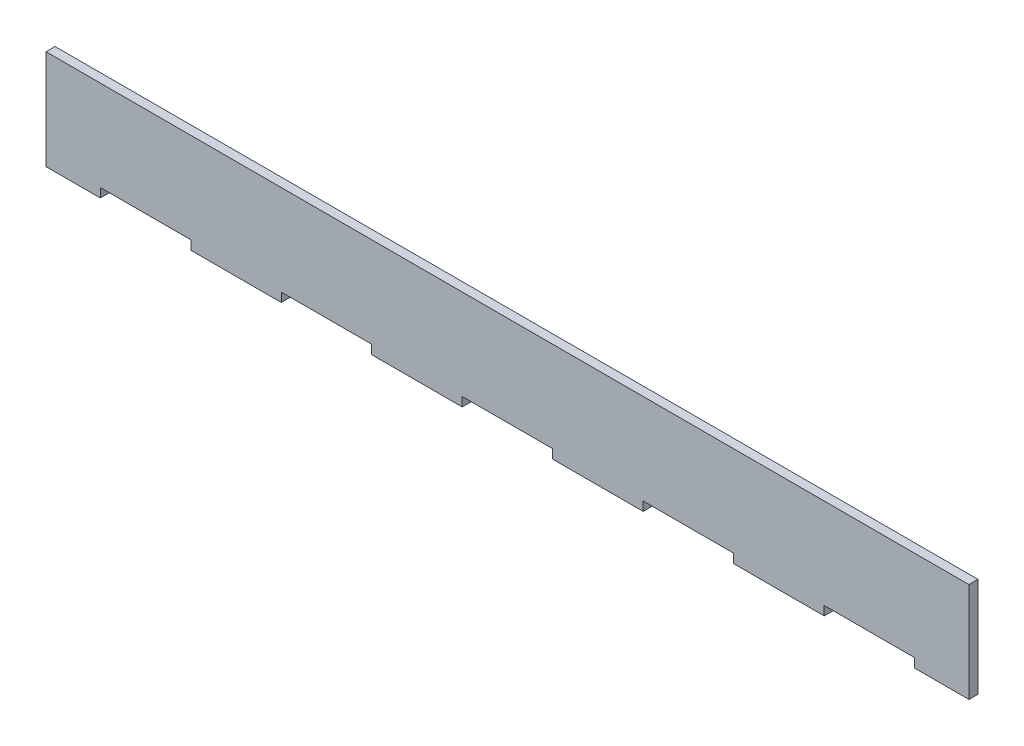
ISO-10303-21;
HEADER;
FILE_DESCRIPTION(('STEP AP214'),'2;1');
FILE_NAME('part.step','',(''),(''),'','','');
FILE_SCHEMA(('AUTOMOTIVE_DESIGN { 1 0 10303 214 1 1 1 1 }'));
ENDSEC;
DATA;
#1=APPLICATION_CONTEXT('core data for automotive mechanical design processes');
#2=APPLICATION_PROTOCOL_DEFINITION('international standard','automotive_design',2000,#1);
#3=PRODUCT_CONTEXT('',#1,'mechanical');
#4=PRODUCT('Part','Part','',(#3));
#5=PRODUCT_RELATED_PRODUCT_CATEGORY('part','',(#4));
#6=PRODUCT_DEFINITION_FORMATION('','',#4);
#7=PRODUCT_DEFINITION_CONTEXT('part definition',#1,'design');
#8=PRODUCT_DEFINITION('design','',#6,#7);
#9=PRODUCT_DEFINITION_SHAPE('','',#8);
#10=(LENGTH_UNIT() NAMED_UNIT(*) SI_UNIT(.MILLI.,.METRE.));
#11=(NAMED_UNIT(*) PLANE_ANGLE_UNIT() SI_UNIT($,.RADIAN.));
#12=(NAMED_UNIT(*) SI_UNIT($,.STERADIAN.) SOLID_ANGLE_UNIT());
#13=UNCERTAINTY_MEASURE_WITH_UNIT(LENGTH_MEASURE(1.E-05),#10,'distance_accuracy_value','');
#14=(GEOMETRIC_REPRESENTATION_CONTEXT(3) GLOBAL_UNCERTAINTY_ASSIGNED_CONTEXT((#13)) GLOBAL_UNIT_ASSIGNED_CONTEXT((#10,
#11,#12)) REPRESENTATION_CONTEXT('',''));
#15=CARTESIAN_POINT('',(0.,0.,0.));
#16=DIRECTION('',(0.,0.,1.));
#17=DIRECTION('',(1.,0.,0.));
#18=AXIS2_PLACEMENT_3D('',#15,#16,#17);
#19=CARTESIAN_POINT('',(255.,-27.5,5.));
#20=DIRECTION('',(0.,1.,0.));
#21=DIRECTION('',(-1.,0.,0.));
#22=AXIS2_PLACEMENT_3D('',#19,#20,#21);
#23=PLANE('',#22);
#24=DIRECTION('',(1.,0.,0.));
#25=VECTOR('',#24,1.);
#26=CARTESIAN_POINT('',(255.,-27.5,0.));
#27=LINE('',#26,#25);
#28=CARTESIAN_POINT('',(25.,-27.5,0.));
#29=VERTEX_POINT('',#28);
#30=CARTESIAN_POINT('',(75.,-27.5,0.));
#31=VERTEX_POINT('',#30);
#32=EDGE_CURVE('E221',#29,#31,#27,.T.);
#33=ORIENTED_EDGE('',*,*,#32,.T.);
#34=DIRECTION('',(0.,0.,1.));
#35=VECTOR('',#34,1.);
#36=CARTESIAN_POINT('',(75.,-27.5,0.));
#37=LINE('',#36,#35);
#38=CARTESIAN_POINT('',(75.,-27.5,5.));
#39=VERTEX_POINT('',#38);
#40=EDGE_CURVE('E325',#31,#39,#37,.T.);
#41=ORIENTED_EDGE('',*,*,#40,.T.);
#42=DIRECTION('',(1.,0.,0.));
#43=VECTOR('',#42,1.);
#44=CARTESIAN_POINT('',(255.,-27.5,5.));
#45=LINE('',#44,#43);
#46=CARTESIAN_POINT('',(25.,-27.5,5.));
#47=VERTEX_POINT('',#46);
#48=EDGE_CURVE('E403',#47,#39,#45,.T.);
#49=ORIENTED_EDGE('',*,*,#48,.F.);
#50=DIRECTION('',(0.,0.,1.));
#51=VECTOR('',#50,1.);
#52=CARTESIAN_POINT('',(25.,-27.5,0.));
#53=LINE('',#52,#51);
#54=EDGE_CURVE('E384',#29,#47,#53,.T.);
#55=ORIENTED_EDGE('',*,*,#54,.F.);
#56=EDGE_LOOP('',(#33,#41,#49,#55));
#57=FACE_BOUND('',#56,.T.);
#58=ADVANCED_FACE('F33',(#57),#23,.F.);
#59=CARTESIAN_POINT('',(-175.,-27.5,0.));
#60=VERTEX_POINT('',#59);
#61=CARTESIAN_POINT('',(-125.,-27.5,0.));
#62=VERTEX_POINT('',#61);
#63=EDGE_CURVE('E232',#60,#62,#27,.T.);
#64=ORIENTED_EDGE('',*,*,#63,.T.);
#65=DIRECTION('',(0.,0.,1.));
#66=VECTOR('',#65,1.);
#67=CARTESIAN_POINT('',(-125.,-27.5,0.));
#68=LINE('',#67,#66);
#69=CARTESIAN_POINT('',(-125.,-27.5,5.));
#70=VERTEX_POINT('',#69);
#71=EDGE_CURVE('E350',#62,#70,#68,.T.);
#72=ORIENTED_EDGE('',*,*,#71,.T.);
#73=CARTESIAN_POINT('',(-175.,-27.5,5.));
#74=VERTEX_POINT('',#73);
#75=EDGE_CURVE('E277',#74,#70,#45,.T.);
#76=ORIENTED_EDGE('',*,*,#75,.F.);
#77=DIRECTION('',(0.,0.,1.));
#78=VECTOR('',#77,1.);
#79=CARTESIAN_POINT('',(-175.,-27.5,0.));
#80=LINE('',#79,#78);
#81=EDGE_CURVE('E315',#60,#74,#80,.T.);
#82=ORIENTED_EDGE('',*,*,#81,.F.);
#83=EDGE_LOOP('',(#64,#72,#76,#82));
#84=FACE_BOUND('',#83,.T.);
#85=ADVANCED_FACE('F428',(#84),#23,.F.);
#86=CARTESIAN_POINT('',(125.,-27.5,5.));
#87=VERTEX_POINT('',#86);
#88=CARTESIAN_POINT('',(175.,-27.5,5.));
#89=VERTEX_POINT('',#88);
#90=EDGE_CURVE('E270',#87,#89,#45,.T.);
#91=ORIENTED_EDGE('',*,*,#90,.F.);
#92=DIRECTION('',(0.,0.,1.));
#93=VECTOR('',#92,1.);
#94=CARTESIAN_POINT('',(125.,-27.5,0.));
#95=LINE('',#94,#93);
#96=CARTESIAN_POINT('',(125.,-27.5,0.));
#97=VERTEX_POINT('',#96);
#98=EDGE_CURVE('E220',#97,#87,#95,.T.);
#99=ORIENTED_EDGE('',*,*,#98,.F.);
#100=CARTESIAN_POINT('',(175.,-27.5,0.));
#101=VERTEX_POINT('',#100);
#102=EDGE_CURVE('E213',#97,#101,#27,.T.);
#103=ORIENTED_EDGE('',*,*,#102,.T.);
#104=DIRECTION('',(0.,0.,1.));
#105=VECTOR('',#104,1.);
#106=CARTESIAN_POINT('',(175.,-27.5,0.));
#107=LINE('',#106,#105);
#108=EDGE_CURVE('E194',#101,#89,#107,.T.);
#109=ORIENTED_EDGE('',*,*,#108,.T.);
#110=EDGE_LOOP('',(#91,#99,#103,#109));
#111=FACE_BOUND('',#110,.T.);
#112=ADVANCED_FACE('F219',(#111),#23,.F.);
#113=CARTESIAN_POINT('',(-255.,-27.5,0.));
#114=VERTEX_POINT('',#113);
#115=CARTESIAN_POINT('',(-225.,-27.5,0.));
#116=VERTEX_POINT('',#115);
#117=EDGE_CURVE('E227',#114,#116,#27,.T.);
#118=ORIENTED_EDGE('',*,*,#117,.T.);
#119=DIRECTION('',(0.,0.,1.));
#120=VECTOR('',#119,1.);
#121=CARTESIAN_POINT('',(-225.,-27.5,0.));
#122=LINE('',#121,#120);
#123=CARTESIAN_POINT('',(-225.,-27.5,5.));
#124=VERTEX_POINT('',#123);
#125=EDGE_CURVE('E303',#116,#124,#122,.T.);
#126=ORIENTED_EDGE('',*,*,#125,.T.);
#127=CARTESIAN_POINT('',(-255.,-27.5,5.));
#128=VERTEX_POINT('',#127);
#129=EDGE_CURVE('E272',#128,#124,#45,.T.);
#130=ORIENTED_EDGE('',*,*,#129,.F.);
#131=DIRECTION('',(0.,0.,-1.));
#132=VECTOR('',#131,1.);
#133=CARTESIAN_POINT('',(-255.,-27.5,5.));
#134=LINE('',#133,#132);
#135=EDGE_CURVE('E11',#128,#114,#134,.T.);
#136=ORIENTED_EDGE('',*,*,#135,.T.);
#137=EDGE_LOOP('',(#118,#126,#130,#136));
#138=FACE_BOUND('',#137,.T.);
#139=ADVANCED_FACE('F440',(#138),#23,.F.);
#140=CARTESIAN_POINT('',(-75.,-27.5,5.));
#141=VERTEX_POINT('',#140);
#142=CARTESIAN_POINT('',(-25.,-27.5,5.));
#143=VERTEX_POINT('',#142);
#144=EDGE_CURVE('E395',#141,#143,#45,.T.);
#145=ORIENTED_EDGE('',*,*,#144,.F.);
#146=DIRECTION('',(0.,0.,1.));
#147=VECTOR('',#146,1.);
#148=CARTESIAN_POINT('',(-75.,-27.5,0.));
#149=LINE('',#148,#147);
#150=CARTESIAN_POINT('',(-75.,-27.5,0.));
#151=VERTEX_POINT('',#150);
#152=EDGE_CURVE('E361',#151,#141,#149,.T.);
#153=ORIENTED_EDGE('',*,*,#152,.F.);
#154=CARTESIAN_POINT('',(-25.,-27.5,0.));
#155=VERTEX_POINT('',#154);
#156=EDGE_CURVE('E225',#151,#155,#27,.T.);
#157=ORIENTED_EDGE('',*,*,#156,.T.);
#158=DIRECTION('',(0.,0.,1.));
#159=VECTOR('',#158,1.);
#160=CARTESIAN_POINT('',(-25.,-27.5,0.));
#161=LINE('',#160,#159);
#162=EDGE_CURVE('E274',#155,#143,#161,.T.);
#163=ORIENTED_EDGE('',*,*,#162,.T.);
#164=EDGE_LOOP('',(#145,#153,#157,#163));
#165=FACE_BOUND('',#164,.T.);
#166=ADVANCED_FACE('F393',(#165),#23,.F.);
#167=CARTESIAN_POINT('',(-255.,27.5,5.));
#168=DIRECTION('',(1.,0.,0.));
#169=DIRECTION('',(0.,0.,-1.));
#170=AXIS2_PLACEMENT_3D('',#167,#168,#169);
#171=PLANE('',#170);
#172=DIRECTION('',(0.,-1.,0.));
#173=VECTOR('',#172,1.);
#174=CARTESIAN_POINT('',(-255.,27.5,0.));
#175=LINE('',#174,#173);
#176=CARTESIAN_POINT('',(-255.,27.5,0.));
#177=VERTEX_POINT('',#176);
#178=EDGE_CURVE('E226',#177,#114,#175,.T.);
#179=ORIENTED_EDGE('',*,*,#178,.T.);
#180=ORIENTED_EDGE('',*,*,#135,.F.);
#181=DIRECTION('',(0.,-1.,0.));
#182=VECTOR('',#181,1.);
#183=CARTESIAN_POINT('',(-255.,27.5,5.));
#184=LINE('',#183,#182);
#185=CARTESIAN_POINT('',(-255.,27.5,5.));
#186=VERTEX_POINT('',#185);
#187=EDGE_CURVE('E237',#186,#128,#184,.T.);
#188=ORIENTED_EDGE('',*,*,#187,.F.);
#189=DIRECTION('',(0.,0.,-1.));
#190=VECTOR('',#189,1.);
#191=CARTESIAN_POINT('',(-255.,27.5,5.));
#192=LINE('',#191,#190);
#193=EDGE_CURVE('E238',#186,#177,#192,.T.);
#194=ORIENTED_EDGE('',*,*,#193,.T.);
#195=EDGE_LOOP('',(#179,#180,#188,#194));
#196=FACE_BOUND('',#195,.T.);
#197=ADVANCED_FACE('F35',(#196),#171,.F.);
#198=CARTESIAN_POINT('',(225.,-27.5,5.));
#199=VERTEX_POINT('',#198);
#200=CARTESIAN_POINT('',(255.,-27.5,5.));
#201=VERTEX_POINT('',#200);
#202=EDGE_CURVE('E268',#199,#201,#45,.T.);
#203=ORIENTED_EDGE('',*,*,#202,.F.);
#204=DIRECTION('',(0.,0.,1.));
#205=VECTOR('',#204,1.);
#206=CARTESIAN_POINT('',(225.,-27.5,0.));
#207=LINE('',#206,#205);
#208=CARTESIAN_POINT('',(225.,-27.5,0.));
#209=VERTEX_POINT('',#208);
#210=EDGE_CURVE('E205',#209,#199,#207,.T.);
#211=ORIENTED_EDGE('',*,*,#210,.F.);
#212=CARTESIAN_POINT('',(255.,-27.5,0.));
#213=VERTEX_POINT('',#212);
#214=EDGE_CURVE('E222',#209,#213,#27,.T.);
#215=ORIENTED_EDGE('',*,*,#214,.T.);
#216=DIRECTION('',(0.,0.,-1.));
#217=VECTOR('',#216,1.);
#218=CARTESIAN_POINT('',(255.,-27.5,5.));
#219=LINE('',#218,#217);
#220=EDGE_CURVE('E41',#201,#213,#219,.T.);
#221=ORIENTED_EDGE('',*,*,#220,.F.);
#222=EDGE_LOOP('',(#203,#211,#215,#221));
#223=FACE_BOUND('',#222,.T.);
#224=ADVANCED_FACE('F285',(#223),#23,.F.);
#225=CARTESIAN_POINT('',(255.,27.5,5.));
#226=DIRECTION('',(-1.,0.,0.));
#227=DIRECTION('',(0.,0.,1.));
#228=AXIS2_PLACEMENT_3D('',#225,#226,#227);
#229=PLANE('',#228);
#230=DIRECTION('',(0.,1.,0.));
#231=VECTOR('',#230,1.);
#232=CARTESIAN_POINT('',(255.,27.5,0.));
#233=LINE('',#232,#231);
#234=CARTESIAN_POINT('',(255.,27.5,0.));
#235=VERTEX_POINT('',#234);
#236=EDGE_CURVE('E231',#213,#235,#233,.T.);
#237=ORIENTED_EDGE('',*,*,#236,.T.);
#238=DIRECTION('',(0.,0.,-1.));
#239=VECTOR('',#238,1.);
#240=CARTESIAN_POINT('',(255.,27.5,5.));
#241=LINE('',#240,#239);
#242=CARTESIAN_POINT('',(255.,27.5,5.));
#243=VERTEX_POINT('',#242);
#244=EDGE_CURVE('E241',#243,#235,#241,.T.);
#245=ORIENTED_EDGE('',*,*,#244,.F.);
#246=DIRECTION('',(0.,1.,0.));
#247=VECTOR('',#246,1.);
#248=CARTESIAN_POINT('',(255.,27.5,5.));
#249=LINE('',#248,#247);
#250=EDGE_CURVE('E251',#201,#243,#249,.T.);
#251=ORIENTED_EDGE('',*,*,#250,.F.);
#252=ORIENTED_EDGE('',*,*,#220,.T.);
#253=EDGE_LOOP('',(#237,#245,#251,#252));
#254=FACE_BOUND('',#253,.T.);
#255=ADVANCED_FACE('F249',(#254),#229,.F.);
#256=CARTESIAN_POINT('',(255.,27.5,5.));
#257=DIRECTION('',(0.,-1.,0.));
#258=DIRECTION('',(1.,0.,0.));
#259=AXIS2_PLACEMENT_3D('',#256,#257,#258);
#260=PLANE('',#259);
#261=DIRECTION('',(-1.,0.,0.));
#262=VECTOR('',#261,1.);
#263=CARTESIAN_POINT('',(255.,27.5,0.));
#264=LINE('',#263,#262);
#265=EDGE_CURVE('E235',#235,#177,#264,.T.);
#266=ORIENTED_EDGE('',*,*,#265,.T.);
#267=ORIENTED_EDGE('',*,*,#193,.F.);
#268=DIRECTION('',(-1.,0.,0.));
#269=VECTOR('',#268,1.);
#270=CARTESIAN_POINT('',(255.,27.5,5.));
#271=LINE('',#270,#269);
#272=EDGE_CURVE('E242',#243,#186,#271,.T.);
#273=ORIENTED_EDGE('',*,*,#272,.F.);
#274=ORIENTED_EDGE('',*,*,#244,.T.);
#275=EDGE_LOOP('',(#266,#267,#273,#274));
#276=FACE_BOUND('',#275,.T.);
#277=ADVANCED_FACE('F260',(#276),#260,.F.);
#278=CARTESIAN_POINT('',(0.,0.,5.));
#279=DIRECTION('',(0.,0.,-1.));
#280=DIRECTION('',(-1.,0.,0.));
#281=AXIS2_PLACEMENT_3D('',#278,#279,#280);
#282=PLANE('',#281);
#283=ORIENTED_EDGE('',*,*,#48,.T.);
#284=DIRECTION('',(0.,-1.,0.));
#285=VECTOR('',#284,1.);
#286=CARTESIAN_POINT('',(75.,-27.5,5.));
#287=LINE('',#286,#285);
#288=CARTESIAN_POINT('',(75.,-22.5,5.));
#289=VERTEX_POINT('',#288);
#290=EDGE_CURVE('E326',#289,#39,#287,.T.);
#291=ORIENTED_EDGE('',*,*,#290,.F.);
#292=DIRECTION('',(-1.,0.,0.));
#293=VECTOR('',#292,1.);
#294=CARTESIAN_POINT('',(75.,-22.5,5.));
#295=LINE('',#294,#293);
#296=CARTESIAN_POINT('',(125.,-22.5,5.));
#297=VERTEX_POINT('',#296);
#298=EDGE_CURVE('E322',#297,#289,#295,.T.);
#299=ORIENTED_EDGE('',*,*,#298,.F.);
#300=DIRECTION('',(0.,1.,0.));
#301=VECTOR('',#300,1.);
#302=CARTESIAN_POINT('',(125.,-27.5,5.));
#303=LINE('',#302,#301);
#304=EDGE_CURVE('E328',#87,#297,#303,.T.);
#305=ORIENTED_EDGE('',*,*,#304,.F.);
#306=ORIENTED_EDGE('',*,*,#90,.T.);
#307=DIRECTION('',(0.,-1.,0.));
#308=VECTOR('',#307,1.);
#309=CARTESIAN_POINT('',(175.,-27.5,5.));
#310=LINE('',#309,#308);
#311=CARTESIAN_POINT('',(175.,-22.5,5.));
#312=VERTEX_POINT('',#311);
#313=EDGE_CURVE('E200',#312,#89,#310,.T.);
#314=ORIENTED_EDGE('',*,*,#313,.F.);
#315=DIRECTION('',(-1.,0.,0.));
#316=VECTOR('',#315,1.);
#317=CARTESIAN_POINT('',(175.,-22.5,5.));
#318=LINE('',#317,#316);
#319=CARTESIAN_POINT('',(225.,-22.5,5.));
#320=VERTEX_POINT('',#319);
#321=EDGE_CURVE('E216',#320,#312,#318,.T.);
#322=ORIENTED_EDGE('',*,*,#321,.F.);
#323=DIRECTION('',(0.,1.,0.));
#324=VECTOR('',#323,1.);
#325=CARTESIAN_POINT('',(225.,-27.5,5.));
#326=LINE('',#325,#324);
#327=EDGE_CURVE('E283',#199,#320,#326,.T.);
#328=ORIENTED_EDGE('',*,*,#327,.F.);
#329=ORIENTED_EDGE('',*,*,#202,.T.);
#330=ORIENTED_EDGE('',*,*,#250,.T.);
#331=ORIENTED_EDGE('',*,*,#272,.T.);
#332=ORIENTED_EDGE('',*,*,#187,.T.);
#333=ORIENTED_EDGE('',*,*,#129,.T.);
#334=DIRECTION('',(0.,-1.,0.));
#335=VECTOR('',#334,1.);
#336=CARTESIAN_POINT('',(-225.,-27.5,5.));
#337=LINE('',#336,#335);
#338=CARTESIAN_POINT('',(-225.,-22.5,5.));
#339=VERTEX_POINT('',#338);
#340=EDGE_CURVE('E304',#339,#124,#337,.T.);
#341=ORIENTED_EDGE('',*,*,#340,.F.);
#342=DIRECTION('',(-1.,0.,0.));
#343=VECTOR('',#342,1.);
#344=CARTESIAN_POINT('',(-225.,-22.5,5.));
#345=LINE('',#344,#343);
#346=CARTESIAN_POINT('',(-175.,-22.5,5.));
#347=VERTEX_POINT('',#346);
#348=EDGE_CURVE('E297',#347,#339,#345,.T.);
#349=ORIENTED_EDGE('',*,*,#348,.F.);
#350=DIRECTION('',(0.,1.,0.));
#351=VECTOR('',#350,1.);
#352=CARTESIAN_POINT('',(-175.,-27.5,5.));
#353=LINE('',#352,#351);
#354=EDGE_CURVE('E306',#74,#347,#353,.T.);
#355=ORIENTED_EDGE('',*,*,#354,.F.);
#356=ORIENTED_EDGE('',*,*,#75,.T.);
#357=DIRECTION('',(0.,-1.,0.));
#358=VECTOR('',#357,1.);
#359=CARTESIAN_POINT('',(-125.,-27.5,5.));
#360=LINE('',#359,#358);
#361=CARTESIAN_POINT('',(-125.,-22.5,5.));
#362=VERTEX_POINT('',#361);
#363=EDGE_CURVE('E351',#362,#70,#360,.T.);
#364=ORIENTED_EDGE('',*,*,#363,.F.);
#365=DIRECTION('',(-1.,0.,0.));
#366=VECTOR('',#365,1.);
#367=CARTESIAN_POINT('',(-125.,-22.5,5.));
#368=LINE('',#367,#366);
#369=CARTESIAN_POINT('',(-75.,-22.5,5.));
#370=VERTEX_POINT('',#369);
#371=EDGE_CURVE('E346',#370,#362,#368,.T.);
#372=ORIENTED_EDGE('',*,*,#371,.F.);
#373=DIRECTION('',(0.,1.,0.));
#374=VECTOR('',#373,1.);
#375=CARTESIAN_POINT('',(-75.,-27.5,5.));
#376=LINE('',#375,#374);
#377=EDGE_CURVE('E353',#141,#370,#376,.T.);
#378=ORIENTED_EDGE('',*,*,#377,.F.);
#379=ORIENTED_EDGE('',*,*,#144,.T.);
#380=DIRECTION('',(0.,-1.,0.));
#381=VECTOR('',#380,1.);
#382=CARTESIAN_POINT('',(-25.,-27.5,5.));
#383=LINE('',#382,#381);
#384=CARTESIAN_POINT('',(-25.,-22.5,5.));
#385=VERTEX_POINT('',#384);
#386=EDGE_CURVE('E336',#385,#143,#383,.T.);
#387=ORIENTED_EDGE('',*,*,#386,.F.);
#388=DIRECTION('',(-1.,0.,0.));
#389=VECTOR('',#388,1.);
#390=CARTESIAN_POINT('',(-25.,-22.5,5.));
#391=LINE('',#390,#389);
#392=CARTESIAN_POINT('',(25.,-22.5,5.));
#393=VERTEX_POINT('',#392);
#394=EDGE_CURVE('E369',#393,#385,#391,.T.);
#395=ORIENTED_EDGE('',*,*,#394,.F.);
#396=DIRECTION('',(0.,1.,0.));
#397=VECTOR('',#396,1.);
#398=CARTESIAN_POINT('',(25.,-27.5,5.));
#399=LINE('',#398,#397);
#400=EDGE_CURVE('E376',#47,#393,#399,.T.);
#401=ORIENTED_EDGE('',*,*,#400,.F.);
#402=EDGE_LOOP('',(#283,#291,#299,#305,#306,#314,#322,#328,#329,#330,#331,#332,#333,#341,#349,
#355,#356,#364,#372,#378,#379,#387,#395,#401));
#403=FACE_BOUND('',#402,.T.);
#404=ADVANCED_FACE('F279',(#403),#282,.F.);
#405=CARTESIAN_POINT('',(0.,0.,0.));
#406=DIRECTION('',(0.,0.,-1.));
#407=DIRECTION('',(-1.,0.,0.));
#408=AXIS2_PLACEMENT_3D('',#405,#406,#407);
#409=PLANE('',#408);
#410=DIRECTION('',(0.,-1.,0.));
#411=VECTOR('',#410,1.);
#412=CARTESIAN_POINT('',(75.,-27.5,0.));
#413=LINE('',#412,#411);
#414=CARTESIAN_POINT('',(75.,-22.5,0.));
#415=VERTEX_POINT('',#414);
#416=EDGE_CURVE('E319',#415,#31,#413,.T.);
#417=ORIENTED_EDGE('',*,*,#416,.T.);
#418=ORIENTED_EDGE('',*,*,#32,.F.);
#419=DIRECTION('',(0.,1.,0.));
#420=VECTOR('',#419,1.);
#421=CARTESIAN_POINT('',(25.,-27.5,0.));
#422=LINE('',#421,#420);
#423=CARTESIAN_POINT('',(25.,-22.5,0.));
#424=VERTEX_POINT('',#423);
#425=EDGE_CURVE('E368',#29,#424,#422,.T.);
#426=ORIENTED_EDGE('',*,*,#425,.T.);
#427=DIRECTION('',(-1.,0.,0.));
#428=VECTOR('',#427,1.);
#429=CARTESIAN_POINT('',(-25.,-22.5,0.));
#430=LINE('',#429,#428);
#431=CARTESIAN_POINT('',(-25.,-22.5,0.));
#432=VERTEX_POINT('',#431);
#433=EDGE_CURVE('E372',#424,#432,#430,.T.);
#434=ORIENTED_EDGE('',*,*,#433,.T.);
#435=DIRECTION('',(0.,-1.,0.));
#436=VECTOR('',#435,1.);
#437=CARTESIAN_POINT('',(-25.,-27.5,0.));
#438=LINE('',#437,#436);
#439=EDGE_CURVE('E365',#432,#155,#438,.T.);
#440=ORIENTED_EDGE('',*,*,#439,.T.);
#441=ORIENTED_EDGE('',*,*,#156,.F.);
#442=DIRECTION('',(0.,1.,0.));
#443=VECTOR('',#442,1.);
#444=CARTESIAN_POINT('',(-75.,-27.5,0.));
#445=LINE('',#444,#443);
#446=CARTESIAN_POINT('',(-75.,-22.5,0.));
#447=VERTEX_POINT('',#446);
#448=EDGE_CURVE('E345',#151,#447,#445,.T.);
#449=ORIENTED_EDGE('',*,*,#448,.T.);
#450=DIRECTION('',(-1.,0.,0.));
#451=VECTOR('',#450,1.);
#452=CARTESIAN_POINT('',(-125.,-22.5,0.));
#453=LINE('',#452,#451);
#454=CARTESIAN_POINT('',(-125.,-22.5,0.));
#455=VERTEX_POINT('',#454);
#456=EDGE_CURVE('E56',#447,#455,#453,.T.);
#457=ORIENTED_EDGE('',*,*,#456,.T.);
#458=DIRECTION('',(0.,-1.,0.));
#459=VECTOR('',#458,1.);
#460=CARTESIAN_POINT('',(-125.,-27.5,0.));
#461=LINE('',#460,#459);
#462=EDGE_CURVE('E342',#455,#62,#461,.T.);
#463=ORIENTED_EDGE('',*,*,#462,.T.);
#464=ORIENTED_EDGE('',*,*,#63,.F.);
#465=DIRECTION('',(0.,1.,0.));
#466=VECTOR('',#465,1.);
#467=CARTESIAN_POINT('',(-175.,-27.5,0.));
#468=LINE('',#467,#466);
#469=CARTESIAN_POINT('',(-175.,-22.5,0.));
#470=VERTEX_POINT('',#469);
#471=EDGE_CURVE('E296',#60,#470,#468,.T.);
#472=ORIENTED_EDGE('',*,*,#471,.T.);
#473=DIRECTION('',(-1.,0.,0.));
#474=VECTOR('',#473,1.);
#475=CARTESIAN_POINT('',(-225.,-22.5,0.));
#476=LINE('',#475,#474);
#477=CARTESIAN_POINT('',(-225.,-22.5,0.));
#478=VERTEX_POINT('',#477);
#479=EDGE_CURVE('E300',#470,#478,#476,.T.);
#480=ORIENTED_EDGE('',*,*,#479,.T.);
#481=DIRECTION('',(0.,-1.,0.));
#482=VECTOR('',#481,1.);
#483=CARTESIAN_POINT('',(-225.,-27.5,0.));
#484=LINE('',#483,#482);
#485=EDGE_CURVE('E293',#478,#116,#484,.T.);
#486=ORIENTED_EDGE('',*,*,#485,.T.);
#487=ORIENTED_EDGE('',*,*,#117,.F.);
#488=ORIENTED_EDGE('',*,*,#178,.F.);
#489=ORIENTED_EDGE('',*,*,#265,.F.);
#490=ORIENTED_EDGE('',*,*,#236,.F.);
#491=ORIENTED_EDGE('',*,*,#214,.F.);
#492=DIRECTION('',(0.,1.,0.));
#493=VECTOR('',#492,1.);
#494=CARTESIAN_POINT('',(225.,-27.5,0.));
#495=LINE('',#494,#493);
#496=CARTESIAN_POINT('',(225.,-22.5,0.));
#497=VERTEX_POINT('',#496);
#498=EDGE_CURVE('E215',#209,#497,#495,.T.);
#499=ORIENTED_EDGE('',*,*,#498,.T.);
#500=DIRECTION('',(-1.,0.,0.));
#501=VECTOR('',#500,1.);
#502=CARTESIAN_POINT('',(175.,-22.5,0.));
#503=LINE('',#502,#501);
#504=CARTESIAN_POINT('',(175.,-22.5,0.));
#505=VERTEX_POINT('',#504);
#506=EDGE_CURVE('E206',#497,#505,#503,.T.);
#507=ORIENTED_EDGE('',*,*,#506,.T.);
#508=DIRECTION('',(0.,-1.,0.));
#509=VECTOR('',#508,1.);
#510=CARTESIAN_POINT('',(175.,-27.5,0.));
#511=LINE('',#510,#509);
#512=EDGE_CURVE('E197',#505,#101,#511,.T.);
#513=ORIENTED_EDGE('',*,*,#512,.T.);
#514=ORIENTED_EDGE('',*,*,#102,.F.);
#515=DIRECTION('',(0.,1.,0.));
#516=VECTOR('',#515,1.);
#517=CARTESIAN_POINT('',(125.,-27.5,0.));
#518=LINE('',#517,#516);
#519=CARTESIAN_POINT('',(125.,-22.5,0.));
#520=VERTEX_POINT('',#519);
#521=EDGE_CURVE('E321',#97,#520,#518,.T.);
#522=ORIENTED_EDGE('',*,*,#521,.T.);
#523=DIRECTION('',(-1.,0.,0.));
#524=VECTOR('',#523,1.);
#525=CARTESIAN_POINT('',(75.,-22.5,0.));
#526=LINE('',#525,#524);
#527=EDGE_CURVE('E48',#520,#415,#526,.T.);
#528=ORIENTED_EDGE('',*,*,#527,.T.);
#529=EDGE_LOOP('',(#417,#418,#426,#434,#440,#441,#449,#457,#463,#464,#472,#480,#486,#487,#488,
#489,#490,#491,#499,#507,#513,#514,#522,#528));
#530=FACE_BOUND('',#529,.T.);
#531=ADVANCED_FACE('F211',(#530),#409,.T.);
#532=CARTESIAN_POINT('',(-25.,-27.5,0.));
#533=DIRECTION('',(-1.,0.,0.));
#534=DIRECTION('',(0.,0.,1.));
#535=AXIS2_PLACEMENT_3D('',#532,#533,#534);
#536=PLANE('',#535);
#537=ORIENTED_EDGE('',*,*,#386,.T.);
#538=ORIENTED_EDGE('',*,*,#162,.F.);
#539=ORIENTED_EDGE('',*,*,#439,.F.);
#540=DIRECTION('',(0.,0.,1.));
#541=VECTOR('',#540,1.);
#542=CARTESIAN_POINT('',(-25.,-22.5,0.));
#543=LINE('',#542,#541);
#544=EDGE_CURVE('E381',#432,#385,#543,.T.);
#545=ORIENTED_EDGE('',*,*,#544,.T.);
#546=EDGE_LOOP('',(#537,#538,#539,#545));
#547=FACE_BOUND('',#546,.T.);
#548=ADVANCED_FACE('F469',(#547),#536,.F.);
#549=CARTESIAN_POINT('',(-25.,-22.5,0.));
#550=DIRECTION('',(0.,1.,0.));
#551=DIRECTION('',(0.,0.,1.));
#552=AXIS2_PLACEMENT_3D('',#549,#550,#551);
#553=PLANE('',#552);
#554=ORIENTED_EDGE('',*,*,#394,.T.);
#555=ORIENTED_EDGE('',*,*,#544,.F.);
#556=ORIENTED_EDGE('',*,*,#433,.F.);
#557=DIRECTION('',(0.,0.,1.));
#558=VECTOR('',#557,1.);
#559=CARTESIAN_POINT('',(25.,-22.5,0.));
#560=LINE('',#559,#558);
#561=EDGE_CURVE('E383',#424,#393,#560,.T.);
#562=ORIENTED_EDGE('',*,*,#561,.T.);
#563=EDGE_LOOP('',(#554,#555,#556,#562));
#564=FACE_BOUND('',#563,.T.);
#565=ADVANCED_FACE('F471',(#564),#553,.F.);
#566=CARTESIAN_POINT('',(25.,-27.5,0.));
#567=DIRECTION('',(1.,0.,0.));
#568=DIRECTION('',(0.,0.,-1.));
#569=AXIS2_PLACEMENT_3D('',#566,#567,#568);
#570=PLANE('',#569);
#571=ORIENTED_EDGE('',*,*,#400,.T.);
#572=ORIENTED_EDGE('',*,*,#561,.F.);
#573=ORIENTED_EDGE('',*,*,#425,.F.);
#574=ORIENTED_EDGE('',*,*,#54,.T.);
#575=EDGE_LOOP('',(#571,#572,#573,#574));
#576=FACE_BOUND('',#575,.T.);
#577=ADVANCED_FACE('F473',(#576),#570,.F.);
#578=CARTESIAN_POINT('',(-225.,-27.5,0.));
#579=DIRECTION('',(-1.,0.,0.));
#580=DIRECTION('',(0.,0.,1.));
#581=AXIS2_PLACEMENT_3D('',#578,#579,#580);
#582=PLANE('',#581);
#583=ORIENTED_EDGE('',*,*,#340,.T.);
#584=ORIENTED_EDGE('',*,*,#125,.F.);
#585=ORIENTED_EDGE('',*,*,#485,.F.);
#586=DIRECTION('',(0.,0.,1.));
#587=VECTOR('',#586,1.);
#588=CARTESIAN_POINT('',(-225.,-22.5,0.));
#589=LINE('',#588,#587);
#590=EDGE_CURVE('E311',#478,#339,#589,.T.);
#591=ORIENTED_EDGE('',*,*,#590,.T.);
#592=EDGE_LOOP('',(#583,#584,#585,#591));
#593=FACE_BOUND('',#592,.T.);
#594=ADVANCED_FACE('F450',(#593),#582,.F.);
#595=CARTESIAN_POINT('',(-225.,-22.5,0.));
#596=DIRECTION('',(0.,1.,0.));
#597=DIRECTION('',(0.,0.,1.));
#598=AXIS2_PLACEMENT_3D('',#595,#596,#597);
#599=PLANE('',#598);
#600=ORIENTED_EDGE('',*,*,#348,.T.);
#601=ORIENTED_EDGE('',*,*,#590,.F.);
#602=ORIENTED_EDGE('',*,*,#479,.F.);
#603=DIRECTION('',(0.,0.,1.));
#604=VECTOR('',#603,1.);
#605=CARTESIAN_POINT('',(-175.,-22.5,0.));
#606=LINE('',#605,#604);
#607=EDGE_CURVE('E313',#470,#347,#606,.T.);
#608=ORIENTED_EDGE('',*,*,#607,.T.);
#609=EDGE_LOOP('',(#600,#601,#602,#608));
#610=FACE_BOUND('',#609,.T.);
#611=ADVANCED_FACE('F456',(#610),#599,.F.);
#612=CARTESIAN_POINT('',(-175.,-27.5,0.));
#613=DIRECTION('',(1.,0.,0.));
#614=DIRECTION('',(0.,0.,-1.));
#615=AXIS2_PLACEMENT_3D('',#612,#613,#614);
#616=PLANE('',#615);
#617=ORIENTED_EDGE('',*,*,#354,.T.);
#618=ORIENTED_EDGE('',*,*,#607,.F.);
#619=ORIENTED_EDGE('',*,*,#471,.F.);
#620=ORIENTED_EDGE('',*,*,#81,.T.);
#621=EDGE_LOOP('',(#617,#618,#619,#620));
#622=FACE_BOUND('',#621,.T.);
#623=ADVANCED_FACE('F459',(#622),#616,.F.);
#624=CARTESIAN_POINT('',(175.,-27.5,0.));
#625=DIRECTION('',(-1.,0.,0.));
#626=DIRECTION('',(0.,0.,1.));
#627=AXIS2_PLACEMENT_3D('',#624,#625,#626);
#628=PLANE('',#627);
#629=ORIENTED_EDGE('',*,*,#313,.T.);
#630=ORIENTED_EDGE('',*,*,#108,.F.);
#631=ORIENTED_EDGE('',*,*,#512,.F.);
#632=DIRECTION('',(0.,0.,1.));
#633=VECTOR('',#632,1.);
#634=CARTESIAN_POINT('',(175.,-22.5,0.));
#635=LINE('',#634,#633);
#636=EDGE_CURVE('E289',#505,#312,#635,.T.);
#637=ORIENTED_EDGE('',*,*,#636,.T.);
#638=EDGE_LOOP('',(#629,#630,#631,#637));
#639=FACE_BOUND('',#638,.T.);
#640=ADVANCED_FACE('F196',(#639),#628,.F.);
#641=CARTESIAN_POINT('',(175.,-22.5,0.));
#642=DIRECTION('',(0.,1.,0.));
#643=DIRECTION('',(0.,0.,1.));
#644=AXIS2_PLACEMENT_3D('',#641,#642,#643);
#645=PLANE('',#644);
#646=ORIENTED_EDGE('',*,*,#321,.T.);
#647=ORIENTED_EDGE('',*,*,#636,.F.);
#648=ORIENTED_EDGE('',*,*,#506,.F.);
#649=DIRECTION('',(0.,0.,1.));
#650=VECTOR('',#649,1.);
#651=CARTESIAN_POINT('',(225.,-22.5,0.));
#652=LINE('',#651,#650);
#653=EDGE_CURVE('E287',#497,#320,#652,.T.);
#654=ORIENTED_EDGE('',*,*,#653,.T.);
#655=EDGE_LOOP('',(#646,#647,#648,#654));
#656=FACE_BOUND('',#655,.T.);
#657=ADVANCED_FACE('F545',(#656),#645,.F.);
#658=CARTESIAN_POINT('',(225.,-27.5,0.));
#659=DIRECTION('',(1.,0.,0.));
#660=DIRECTION('',(0.,0.,-1.));
#661=AXIS2_PLACEMENT_3D('',#658,#659,#660);
#662=PLANE('',#661);
#663=ORIENTED_EDGE('',*,*,#327,.T.);
#664=ORIENTED_EDGE('',*,*,#653,.F.);
#665=ORIENTED_EDGE('',*,*,#498,.F.);
#666=ORIENTED_EDGE('',*,*,#210,.T.);
#667=EDGE_LOOP('',(#663,#664,#665,#666));
#668=FACE_BOUND('',#667,.T.);
#669=ADVANCED_FACE('F554',(#668),#662,.F.);
#670=CARTESIAN_POINT('',(-125.,-27.5,0.));
#671=DIRECTION('',(-1.,0.,0.));
#672=DIRECTION('',(0.,0.,1.));
#673=AXIS2_PLACEMENT_3D('',#670,#671,#672);
#674=PLANE('',#673);
#675=ORIENTED_EDGE('',*,*,#363,.T.);
#676=ORIENTED_EDGE('',*,*,#71,.F.);
#677=ORIENTED_EDGE('',*,*,#462,.F.);
#678=DIRECTION('',(0.,0.,1.));
#679=VECTOR('',#678,1.);
#680=CARTESIAN_POINT('',(-125.,-22.5,0.));
#681=LINE('',#680,#679);
#682=EDGE_CURVE('E329',#455,#362,#681,.T.);
#683=ORIENTED_EDGE('',*,*,#682,.T.);
#684=EDGE_LOOP('',(#675,#676,#677,#683));
#685=FACE_BOUND('',#684,.T.);
#686=ADVANCED_FACE('F465',(#685),#674,.F.);
#687=CARTESIAN_POINT('',(-125.,-22.5,0.));
#688=DIRECTION('',(0.,1.,0.));
#689=DIRECTION('',(0.,0.,1.));
#690=AXIS2_PLACEMENT_3D('',#687,#688,#689);
#691=PLANE('',#690);
#692=ORIENTED_EDGE('',*,*,#371,.T.);
#693=ORIENTED_EDGE('',*,*,#682,.F.);
#694=ORIENTED_EDGE('',*,*,#456,.F.);
#695=DIRECTION('',(0.,0.,1.));
#696=VECTOR('',#695,1.);
#697=CARTESIAN_POINT('',(-75.,-22.5,0.));
#698=LINE('',#697,#696);
#699=EDGE_CURVE('E359',#447,#370,#698,.T.);
#700=ORIENTED_EDGE('',*,*,#699,.T.);
#701=EDGE_LOOP('',(#692,#693,#694,#700));
#702=FACE_BOUND('',#701,.T.);
#703=ADVANCED_FACE('F467',(#702),#691,.F.);
#704=CARTESIAN_POINT('',(-75.,-27.5,0.));
#705=DIRECTION('',(1.,0.,0.));
#706=DIRECTION('',(0.,0.,-1.));
#707=AXIS2_PLACEMENT_3D('',#704,#705,#706);
#708=PLANE('',#707);
#709=ORIENTED_EDGE('',*,*,#377,.T.);
#710=ORIENTED_EDGE('',*,*,#699,.F.);
#711=ORIENTED_EDGE('',*,*,#448,.F.);
#712=ORIENTED_EDGE('',*,*,#152,.T.);
#713=EDGE_LOOP('',(#709,#710,#711,#712));
#714=FACE_BOUND('',#713,.T.);
#715=ADVANCED_FACE('F424',(#714),#708,.F.);
#716=CARTESIAN_POINT('',(75.,-27.5,0.));
#717=DIRECTION('',(-1.,0.,0.));
#718=DIRECTION('',(0.,0.,1.));
#719=AXIS2_PLACEMENT_3D('',#716,#717,#718);
#720=PLANE('',#719);
#721=ORIENTED_EDGE('',*,*,#290,.T.);
#722=ORIENTED_EDGE('',*,*,#40,.F.);
#723=ORIENTED_EDGE('',*,*,#416,.F.);
#724=DIRECTION('',(0.,0.,1.));
#725=VECTOR('',#724,1.);
#726=CARTESIAN_POINT('',(75.,-22.5,0.));
#727=LINE('',#726,#725);
#728=EDGE_CURVE('E334',#415,#289,#727,.T.);
#729=ORIENTED_EDGE('',*,*,#728,.T.);
#730=EDGE_LOOP('',(#721,#722,#723,#729));
#731=FACE_BOUND('',#730,.T.);
#732=ADVANCED_FACE('F415',(#731),#720,.F.);
#733=CARTESIAN_POINT('',(75.,-22.5,0.));
#734=DIRECTION('',(0.,1.,0.));
#735=DIRECTION('',(0.,0.,1.));
#736=AXIS2_PLACEMENT_3D('',#733,#734,#735);
#737=PLANE('',#736);
#738=ORIENTED_EDGE('',*,*,#298,.T.);
#739=ORIENTED_EDGE('',*,*,#728,.F.);
#740=ORIENTED_EDGE('',*,*,#527,.F.);
#741=DIRECTION('',(0.,0.,1.));
#742=VECTOR('',#741,1.);
#743=CARTESIAN_POINT('',(125.,-22.5,0.));
#744=LINE('',#743,#742);
#745=EDGE_CURVE('E337',#520,#297,#744,.T.);
#746=ORIENTED_EDGE('',*,*,#745,.T.);
#747=EDGE_LOOP('',(#738,#739,#740,#746));
#748=FACE_BOUND('',#747,.T.);
#749=ADVANCED_FACE('F416',(#748),#737,.F.);
#750=CARTESIAN_POINT('',(125.,-27.5,0.));
#751=DIRECTION('',(1.,0.,0.));
#752=DIRECTION('',(0.,0.,-1.));
#753=AXIS2_PLACEMENT_3D('',#750,#751,#752);
#754=PLANE('',#753);
#755=ORIENTED_EDGE('',*,*,#304,.T.);
#756=ORIENTED_EDGE('',*,*,#745,.F.);
#757=ORIENTED_EDGE('',*,*,#521,.F.);
#758=ORIENTED_EDGE('',*,*,#98,.T.);
#759=EDGE_LOOP('',(#755,#756,#757,#758));
#760=FACE_BOUND('',#759,.T.);
#761=ADVANCED_FACE('F410',(#760),#754,.F.);
#762=CLOSED_SHELL('',(#58,#85,#112,#139,#166,#197,#224,#255,#277,#404,#531,#548,#565,#577,#594,
#611,#623,#640,#657,#669,#686,#703,#715,#732,#749,#761));
#763=MANIFOLD_SOLID_BREP('B2',#762);
#764=ADVANCED_BREP_SHAPE_REPRESENTATION('',(#18,#763),#14);
#765=SHAPE_DEFINITION_REPRESENTATION(#9,#764);
ENDSEC;
END-ISO-10303-21;
